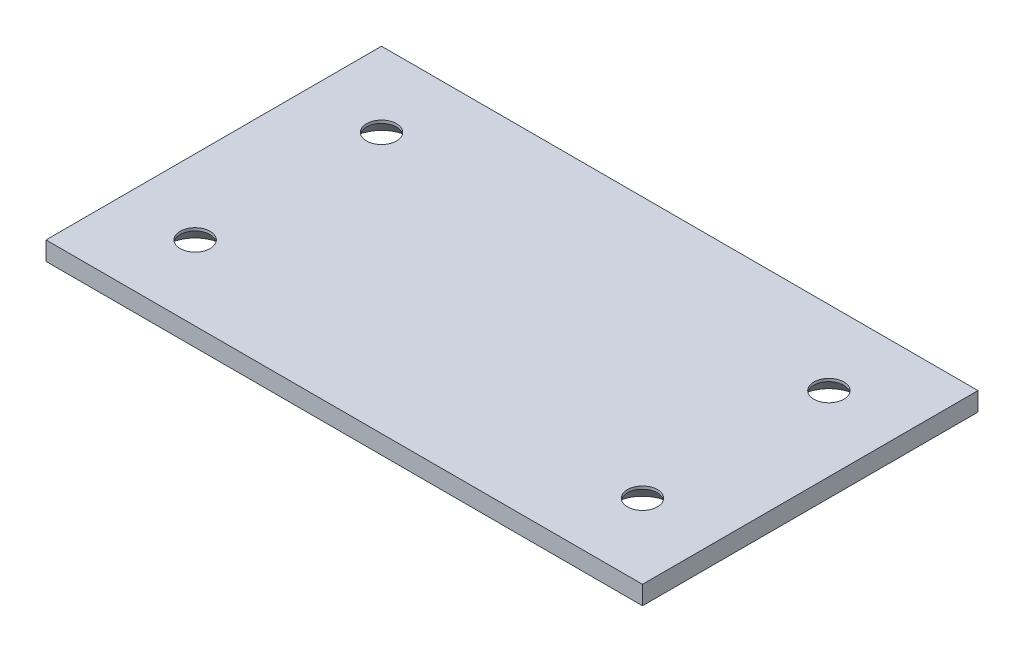
ISO-10303-21;
HEADER;
FILE_DESCRIPTION(('STEP AP214'),'2;1');
FILE_NAME('part.step','',(''),(''),'','','');
FILE_SCHEMA(('AUTOMOTIVE_DESIGN { 1 0 10303 214 1 1 1 1 }'));
ENDSEC;
DATA;
#1=APPLICATION_CONTEXT('core data for automotive mechanical design processes');
#2=APPLICATION_PROTOCOL_DEFINITION('international standard','automotive_design',2000,#1);
#3=PRODUCT_CONTEXT('',#1,'mechanical');
#4=PRODUCT('Part','Part','',(#3));
#5=PRODUCT_RELATED_PRODUCT_CATEGORY('part','',(#4));
#6=PRODUCT_DEFINITION_FORMATION('','',#4);
#7=PRODUCT_DEFINITION_CONTEXT('part definition',#1,'design');
#8=PRODUCT_DEFINITION('design','',#6,#7);
#9=PRODUCT_DEFINITION_SHAPE('','',#8);
#10=(LENGTH_UNIT() NAMED_UNIT(*) SI_UNIT(.MILLI.,.METRE.));
#11=(NAMED_UNIT(*) PLANE_ANGLE_UNIT() SI_UNIT($,.RADIAN.));
#12=(NAMED_UNIT(*) SI_UNIT($,.STERADIAN.) SOLID_ANGLE_UNIT());
#13=UNCERTAINTY_MEASURE_WITH_UNIT(LENGTH_MEASURE(1.E-05),#10,'distance_accuracy_value','');
#14=(GEOMETRIC_REPRESENTATION_CONTEXT(3) GLOBAL_UNCERTAINTY_ASSIGNED_CONTEXT((#13)) GLOBAL_UNIT_ASSIGNED_CONTEXT((#10,
#11,#12)) REPRESENTATION_CONTEXT('',''));
#15=CARTESIAN_POINT('',(0.,0.,0.));
#16=DIRECTION('',(0.,0.,1.));
#17=DIRECTION('',(1.,0.,0.));
#18=AXIS2_PLACEMENT_3D('',#15,#16,#17);
#19=CARTESIAN_POINT('',(50.8,3.175,28.575));
#20=DIRECTION('',(-1.,0.,0.));
#21=DIRECTION('',(0.,0.,1.));
#22=AXIS2_PLACEMENT_3D('',#19,#20,#21);
#23=PLANE('',#22);
#24=DIRECTION('',(0.,0.,-1.));
#25=VECTOR('',#24,1.);
#26=CARTESIAN_POINT('',(50.8,0.,28.575));
#27=LINE('',#26,#25);
#28=CARTESIAN_POINT('',(50.8,0.,28.575));
#29=VERTEX_POINT('',#28);
#30=CARTESIAN_POINT('',(50.8,0.,-28.575));
#31=VERTEX_POINT('',#30);
#32=EDGE_CURVE('E99',#29,#31,#27,.T.);
#33=ORIENTED_EDGE('',*,*,#32,.T.);
#34=DIRECTION('',(0.,-1.,0.));
#35=VECTOR('',#34,1.);
#36=CARTESIAN_POINT('',(50.8,3.175,-28.575));
#37=LINE('',#36,#35);
#38=CARTESIAN_POINT('',(50.8,3.175,-28.575));
#39=VERTEX_POINT('',#38);
#40=EDGE_CURVE('E11',#39,#31,#37,.T.);
#41=ORIENTED_EDGE('',*,*,#40,.F.);
#42=DIRECTION('',(0.,0.,-1.));
#43=VECTOR('',#42,1.);
#44=CARTESIAN_POINT('',(50.8,3.175,28.575));
#45=LINE('',#44,#43);
#46=CARTESIAN_POINT('',(50.8,3.175,28.575));
#47=VERTEX_POINT('',#46);
#48=EDGE_CURVE('E87',#47,#39,#45,.T.);
#49=ORIENTED_EDGE('',*,*,#48,.F.);
#50=DIRECTION('',(0.,-1.,0.));
#51=VECTOR('',#50,1.);
#52=CARTESIAN_POINT('',(50.8,3.175,28.575));
#53=LINE('',#52,#51);
#54=EDGE_CURVE('E95',#47,#29,#53,.T.);
#55=ORIENTED_EDGE('',*,*,#54,.T.);
#56=EDGE_LOOP('',(#33,#41,#49,#55));
#57=FACE_BOUND('',#56,.T.);
#58=ADVANCED_FACE('F36',(#57),#23,.F.);
#59=CARTESIAN_POINT('',(-50.8,3.175,-28.575));
#60=DIRECTION('',(0.,0.,1.));
#61=DIRECTION('',(1.,0.,0.));
#62=AXIS2_PLACEMENT_3D('',#59,#60,#61);
#63=PLANE('',#62);
#64=DIRECTION('',(-1.,0.,0.));
#65=VECTOR('',#64,1.);
#66=CARTESIAN_POINT('',(-50.8,0.,-28.575));
#67=LINE('',#66,#65);
#68=CARTESIAN_POINT('',(-50.8,0.,-28.575));
#69=VERTEX_POINT('',#68);
#70=EDGE_CURVE('E91',#31,#69,#67,.T.);
#71=ORIENTED_EDGE('',*,*,#70,.T.);
#72=DIRECTION('',(0.,-1.,0.));
#73=VECTOR('',#72,1.);
#74=CARTESIAN_POINT('',(-50.8,3.175,-28.575));
#75=LINE('',#74,#73);
#76=CARTESIAN_POINT('',(-50.8,3.175,-28.575));
#77=VERTEX_POINT('',#76);
#78=EDGE_CURVE('E44',#77,#69,#75,.T.);
#79=ORIENTED_EDGE('',*,*,#78,.F.);
#80=DIRECTION('',(-1.,0.,0.));
#81=VECTOR('',#80,1.);
#82=CARTESIAN_POINT('',(-50.8,3.175,-28.575));
#83=LINE('',#82,#81);
#84=EDGE_CURVE('E82',#39,#77,#83,.T.);
#85=ORIENTED_EDGE('',*,*,#84,.F.);
#86=ORIENTED_EDGE('',*,*,#40,.T.);
#87=EDGE_LOOP('',(#71,#79,#85,#86));
#88=FACE_BOUND('',#87,.T.);
#89=ADVANCED_FACE('F90',(#88),#63,.F.);
#90=CARTESIAN_POINT('',(-50.8,3.175,28.575));
#91=DIRECTION('',(1.,0.,0.));
#92=DIRECTION('',(0.,0.,-1.));
#93=AXIS2_PLACEMENT_3D('',#90,#91,#92);
#94=PLANE('',#93);
#95=DIRECTION('',(0.,0.,1.));
#96=VECTOR('',#95,1.);
#97=CARTESIAN_POINT('',(-50.8,0.,28.575));
#98=LINE('',#97,#96);
#99=CARTESIAN_POINT('',(-50.8,0.,28.575));
#100=VERTEX_POINT('',#99);
#101=EDGE_CURVE('E69',#69,#100,#98,.T.);
#102=ORIENTED_EDGE('',*,*,#101,.T.);
#103=DIRECTION('',(0.,-1.,0.));
#104=VECTOR('',#103,1.);
#105=CARTESIAN_POINT('',(-50.8,3.175,28.575));
#106=LINE('',#105,#104);
#107=CARTESIAN_POINT('',(-50.8,3.175,28.575));
#108=VERTEX_POINT('',#107);
#109=EDGE_CURVE('E92',#108,#100,#106,.T.);
#110=ORIENTED_EDGE('',*,*,#109,.F.);
#111=DIRECTION('',(0.,0.,1.));
#112=VECTOR('',#111,1.);
#113=CARTESIAN_POINT('',(-50.8,3.175,28.575));
#114=LINE('',#113,#112);
#115=EDGE_CURVE('E85',#77,#108,#114,.T.);
#116=ORIENTED_EDGE('',*,*,#115,.F.);
#117=ORIENTED_EDGE('',*,*,#78,.T.);
#118=EDGE_LOOP('',(#102,#110,#116,#117));
#119=FACE_BOUND('',#118,.T.);
#120=ADVANCED_FACE('F93',(#119),#94,.F.);
#121=CARTESIAN_POINT('',(-50.8,3.175,28.575));
#122=DIRECTION('',(0.,0.,-1.));
#123=DIRECTION('',(-1.,0.,0.));
#124=AXIS2_PLACEMENT_3D('',#121,#122,#123);
#125=PLANE('',#124);
#126=DIRECTION('',(1.,0.,0.));
#127=VECTOR('',#126,1.);
#128=CARTESIAN_POINT('',(-50.8,0.,28.575));
#129=LINE('',#128,#127);
#130=EDGE_CURVE('E75',#100,#29,#129,.T.);
#131=ORIENTED_EDGE('',*,*,#130,.T.);
#132=ORIENTED_EDGE('',*,*,#54,.F.);
#133=DIRECTION('',(1.,0.,0.));
#134=VECTOR('',#133,1.);
#135=CARTESIAN_POINT('',(-50.8,3.175,28.575));
#136=LINE('',#135,#134);
#137=EDGE_CURVE('E52',#108,#47,#136,.T.);
#138=ORIENTED_EDGE('',*,*,#137,.F.);
#139=ORIENTED_EDGE('',*,*,#109,.T.);
#140=EDGE_LOOP('',(#131,#132,#138,#139));
#141=FACE_BOUND('',#140,.T.);
#142=ADVANCED_FACE('F107',(#141),#125,.F.);
#143=CARTESIAN_POINT('',(0.,3.175,0.));
#144=DIRECTION('',(0.,-1.,0.));
#145=DIRECTION('',(0.,0.,-1.));
#146=AXIS2_PLACEMENT_3D('',#143,#144,#145);
#147=PLANE('',#146);
#148=CARTESIAN_POINT('',(-38.1,3.175,15.875));
#149=DIRECTION('',(0.,-1.,0.));
#150=DIRECTION('',(0.,0.,-1.));
#151=AXIS2_PLACEMENT_3D('',#148,#149,#150);
#152=CIRCLE('',#151,2.5527);
#153=CARTESIAN_POINT('',(-38.1,3.175,13.3223));
#154=VERTEX_POINT('',#153);
#155=EDGE_CURVE('E139',#154,#154,#152,.T.);
#156=ORIENTED_EDGE('',*,*,#155,.T.);
#157=EDGE_LOOP('',(#156));
#158=FACE_BOUND('',#157,.T.);
#159=CARTESIAN_POINT('',(-38.1,3.175,-15.875));
#160=DIRECTION('',(0.,-1.,0.));
#161=DIRECTION('',(0.,0.,-1.));
#162=AXIS2_PLACEMENT_3D('',#159,#160,#161);
#163=CIRCLE('',#162,2.5527);
#164=CARTESIAN_POINT('',(-38.1,3.175,-18.4277));
#165=VERTEX_POINT('',#164);
#166=EDGE_CURVE('E130',#165,#165,#163,.T.);
#167=ORIENTED_EDGE('',*,*,#166,.T.);
#168=EDGE_LOOP('',(#167));
#169=FACE_BOUND('',#168,.T.);
#170=CARTESIAN_POINT('',(38.1,3.175,15.875));
#171=DIRECTION('',(0.,-1.,0.));
#172=DIRECTION('',(0.,0.,-1.));
#173=AXIS2_PLACEMENT_3D('',#170,#171,#172);
#174=CIRCLE('',#173,2.5527);
#175=CARTESIAN_POINT('',(38.1,3.175,13.3223));
#176=VERTEX_POINT('',#175);
#177=EDGE_CURVE('E121',#176,#176,#174,.T.);
#178=ORIENTED_EDGE('',*,*,#177,.T.);
#179=EDGE_LOOP('',(#178));
#180=FACE_BOUND('',#179,.T.);
#181=CARTESIAN_POINT('',(38.1,3.175,-15.875));
#182=DIRECTION('',(0.,-1.,0.));
#183=DIRECTION('',(0.,0.,-1.));
#184=AXIS2_PLACEMENT_3D('',#181,#182,#183);
#185=CIRCLE('',#184,2.5527);
#186=CARTESIAN_POINT('',(38.1,3.175,-18.4277));
#187=VERTEX_POINT('',#186);
#188=EDGE_CURVE('E102',#187,#187,#185,.T.);
#189=ORIENTED_EDGE('',*,*,#188,.T.);
#190=EDGE_LOOP('',(#189));
#191=FACE_BOUND('',#190,.T.);
#192=ORIENTED_EDGE('',*,*,#48,.T.);
#193=ORIENTED_EDGE('',*,*,#84,.T.);
#194=ORIENTED_EDGE('',*,*,#115,.T.);
#195=ORIENTED_EDGE('',*,*,#137,.T.);
#196=EDGE_LOOP('',(#192,#193,#194,#195));
#197=FACE_BOUND('',#196,.T.);
#198=ADVANCED_FACE('F83',(#158,#169,#180,#191,#197),#147,.F.);
#199=CARTESIAN_POINT('',(0.,0.,0.));
#200=DIRECTION('',(0.,-1.,0.));
#201=DIRECTION('',(0.,0.,-1.));
#202=AXIS2_PLACEMENT_3D('',#199,#200,#201);
#203=PLANE('',#202);
#204=CARTESIAN_POINT('',(-38.1,0.,15.875));
#205=DIRECTION('',(0.,-1.,0.));
#206=DIRECTION('',(0.,0.,-1.));
#207=AXIS2_PLACEMENT_3D('',#204,#205,#206);
#208=CIRCLE('',#207,4.8895);
#209=CARTESIAN_POINT('',(-38.1,0.,10.9855));
#210=VERTEX_POINT('',#209);
#211=EDGE_CURVE('E145',#210,#210,#208,.T.);
#212=ORIENTED_EDGE('',*,*,#211,.F.);
#213=EDGE_LOOP('',(#212));
#214=FACE_BOUND('',#213,.T.);
#215=CARTESIAN_POINT('',(-38.1,0.,-15.875));
#216=DIRECTION('',(0.,-1.,0.));
#217=DIRECTION('',(0.,0.,-1.));
#218=AXIS2_PLACEMENT_3D('',#215,#216,#217);
#219=CIRCLE('',#218,4.8895);
#220=CARTESIAN_POINT('',(-38.1,0.,-20.7645));
#221=VERTEX_POINT('',#220);
#222=EDGE_CURVE('E136',#221,#221,#219,.T.);
#223=ORIENTED_EDGE('',*,*,#222,.F.);
#224=EDGE_LOOP('',(#223));
#225=FACE_BOUND('',#224,.T.);
#226=CARTESIAN_POINT('',(38.1,0.,15.875));
#227=DIRECTION('',(0.,-1.,0.));
#228=DIRECTION('',(0.,0.,-1.));
#229=AXIS2_PLACEMENT_3D('',#226,#227,#228);
#230=CIRCLE('',#229,4.8895);
#231=CARTESIAN_POINT('',(38.1,0.,10.9855));
#232=VERTEX_POINT('',#231);
#233=EDGE_CURVE('E127',#232,#232,#230,.T.);
#234=ORIENTED_EDGE('',*,*,#233,.F.);
#235=EDGE_LOOP('',(#234));
#236=FACE_BOUND('',#235,.T.);
#237=CARTESIAN_POINT('',(38.1,0.,-15.875));
#238=DIRECTION('',(0.,-1.,0.));
#239=DIRECTION('',(0.,0.,-1.));
#240=AXIS2_PLACEMENT_3D('',#237,#238,#239);
#241=CIRCLE('',#240,4.8895);
#242=CARTESIAN_POINT('',(38.1,0.,-20.7645));
#243=VERTEX_POINT('',#242);
#244=EDGE_CURVE('E118',#243,#243,#241,.T.);
#245=ORIENTED_EDGE('',*,*,#244,.F.);
#246=EDGE_LOOP('',(#245));
#247=FACE_BOUND('',#246,.T.);
#248=ORIENTED_EDGE('',*,*,#32,.F.);
#249=ORIENTED_EDGE('',*,*,#130,.F.);
#250=ORIENTED_EDGE('',*,*,#101,.F.);
#251=ORIENTED_EDGE('',*,*,#70,.F.);
#252=EDGE_LOOP('',(#248,#249,#250,#251));
#253=FACE_BOUND('',#252,.T.);
#254=ADVANCED_FACE('F110',(#214,#225,#236,#247,#253),#203,.T.);
#255=CARTESIAN_POINT('',(38.1,0.,-15.875));
#256=DIRECTION('',(0.,-1.,0.));
#257=DIRECTION('',(0.,0.,-1.));
#258=AXIS2_PLACEMENT_3D('',#255,#256,#257);
#259=CYLINDRICAL_SURFACE('',#258,2.5527);
#260=ORIENTED_EDGE('',*,*,#188,.F.);
#261=EDGE_LOOP('',(#260));
#262=FACE_BOUND('',#261,.T.);
#263=CARTESIAN_POINT('',(38.1,2.68818089399406,-15.875));
#264=DIRECTION('',(0.,-1.,0.));
#265=DIRECTION('',(0.,0.,-1.));
#266=AXIS2_PLACEMENT_3D('',#263,#264,#265);
#267=CIRCLE('',#266,2.5527);
#268=CARTESIAN_POINT('',(38.1,2.68818089399406,-18.4277));
#269=VERTEX_POINT('',#268);
#270=EDGE_CURVE('E115',#269,#269,#267,.T.);
#271=ORIENTED_EDGE('',*,*,#270,.T.);
#272=EDGE_LOOP('',(#271));
#273=FACE_BOUND('',#272,.T.);
#274=ADVANCED_FACE('F153',(#262,#273),#259,.F.);
#275=CARTESIAN_POINT('',(38.1,0.,-15.875));
#276=DIRECTION('',(0.,-1.,0.));
#277=DIRECTION('',(0.,0.,-1.));
#278=AXIS2_PLACEMENT_3D('',#275,#276,#277);
#279=CONICAL_SURFACE('',#278,4.8895,0.715584993317675);
#280=ORIENTED_EDGE('',*,*,#270,.F.);
#281=EDGE_LOOP('',(#280));
#282=FACE_BOUND('',#281,.T.);
#283=ORIENTED_EDGE('',*,*,#244,.T.);
#284=EDGE_LOOP('',(#283));
#285=FACE_BOUND('',#284,.T.);
#286=ADVANCED_FACE('F161',(#282,#285),#279,.F.);
#287=CARTESIAN_POINT('',(38.1,0.,15.875));
#288=DIRECTION('',(0.,-1.,0.));
#289=DIRECTION('',(0.,0.,-1.));
#290=AXIS2_PLACEMENT_3D('',#287,#288,#289);
#291=CYLINDRICAL_SURFACE('',#290,2.5527);
#292=ORIENTED_EDGE('',*,*,#177,.F.);
#293=EDGE_LOOP('',(#292));
#294=FACE_BOUND('',#293,.T.);
#295=CARTESIAN_POINT('',(38.1,2.68818089399406,15.875));
#296=DIRECTION('',(0.,-1.,0.));
#297=DIRECTION('',(0.,0.,-1.));
#298=AXIS2_PLACEMENT_3D('',#295,#296,#297);
#299=CIRCLE('',#298,2.5527);
#300=CARTESIAN_POINT('',(38.1,2.68818089399406,13.3223));
#301=VERTEX_POINT('',#300);
#302=EDGE_CURVE('E124',#301,#301,#299,.T.);
#303=ORIENTED_EDGE('',*,*,#302,.T.);
#304=EDGE_LOOP('',(#303));
#305=FACE_BOUND('',#304,.T.);
#306=ADVANCED_FACE('F163',(#294,#305),#291,.F.);
#307=CARTESIAN_POINT('',(38.1,0.,15.875));
#308=DIRECTION('',(0.,-1.,0.));
#309=DIRECTION('',(0.,0.,-1.));
#310=AXIS2_PLACEMENT_3D('',#307,#308,#309);
#311=CONICAL_SURFACE('',#310,4.8895,0.715584993317675);
#312=ORIENTED_EDGE('',*,*,#302,.F.);
#313=EDGE_LOOP('',(#312));
#314=FACE_BOUND('',#313,.T.);
#315=ORIENTED_EDGE('',*,*,#233,.T.);
#316=EDGE_LOOP('',(#315));
#317=FACE_BOUND('',#316,.T.);
#318=ADVANCED_FACE('F170',(#314,#317),#311,.F.);
#319=CARTESIAN_POINT('',(-38.1,0.,-15.875));
#320=DIRECTION('',(0.,-1.,0.));
#321=DIRECTION('',(0.,0.,-1.));
#322=AXIS2_PLACEMENT_3D('',#319,#320,#321);
#323=CYLINDRICAL_SURFACE('',#322,2.5527);
#324=ORIENTED_EDGE('',*,*,#166,.F.);
#325=EDGE_LOOP('',(#324));
#326=FACE_BOUND('',#325,.T.);
#327=CARTESIAN_POINT('',(-38.1,2.68818089399406,-15.875));
#328=DIRECTION('',(0.,-1.,0.));
#329=DIRECTION('',(0.,0.,-1.));
#330=AXIS2_PLACEMENT_3D('',#327,#328,#329);
#331=CIRCLE('',#330,2.5527);
#332=CARTESIAN_POINT('',(-38.1,2.68818089399406,-18.4277));
#333=VERTEX_POINT('',#332);
#334=EDGE_CURVE('E133',#333,#333,#331,.T.);
#335=ORIENTED_EDGE('',*,*,#334,.T.);
#336=EDGE_LOOP('',(#335));
#337=FACE_BOUND('',#336,.T.);
#338=ADVANCED_FACE('F204',(#326,#337),#323,.F.);
#339=CARTESIAN_POINT('',(-38.1,0.,-15.875));
#340=DIRECTION('',(0.,-1.,0.));
#341=DIRECTION('',(0.,0.,-1.));
#342=AXIS2_PLACEMENT_3D('',#339,#340,#341);
#343=CONICAL_SURFACE('',#342,4.8895,0.715584993317675);
#344=ORIENTED_EDGE('',*,*,#334,.F.);
#345=EDGE_LOOP('',(#344));
#346=FACE_BOUND('',#345,.T.);
#347=ORIENTED_EDGE('',*,*,#222,.T.);
#348=EDGE_LOOP('',(#347));
#349=FACE_BOUND('',#348,.T.);
#350=ADVANCED_FACE('F209',(#346,#349),#343,.F.);
#351=CARTESIAN_POINT('',(-38.1,0.,15.875));
#352=DIRECTION('',(0.,-1.,0.));
#353=DIRECTION('',(0.,0.,-1.));
#354=AXIS2_PLACEMENT_3D('',#351,#352,#353);
#355=CYLINDRICAL_SURFACE('',#354,2.5527);
#356=ORIENTED_EDGE('',*,*,#155,.F.);
#357=EDGE_LOOP('',(#356));
#358=FACE_BOUND('',#357,.T.);
#359=CARTESIAN_POINT('',(-38.1,2.68818089399406,15.875));
#360=DIRECTION('',(0.,-1.,0.));
#361=DIRECTION('',(0.,0.,-1.));
#362=AXIS2_PLACEMENT_3D('',#359,#360,#361);
#363=CIRCLE('',#362,2.5527);
#364=CARTESIAN_POINT('',(-38.1,2.68818089399406,13.3223));
#365=VERTEX_POINT('',#364);
#366=EDGE_CURVE('E142',#365,#365,#363,.T.);
#367=ORIENTED_EDGE('',*,*,#366,.T.);
#368=EDGE_LOOP('',(#367));
#369=FACE_BOUND('',#368,.T.);
#370=ADVANCED_FACE('F215',(#358,#369),#355,.F.);
#371=CARTESIAN_POINT('',(-38.1,0.,15.875));
#372=DIRECTION('',(0.,-1.,0.));
#373=DIRECTION('',(0.,0.,-1.));
#374=AXIS2_PLACEMENT_3D('',#371,#372,#373);
#375=CONICAL_SURFACE('',#374,4.8895,0.715584993317675);
#376=ORIENTED_EDGE('',*,*,#366,.F.);
#377=EDGE_LOOP('',(#376));
#378=FACE_BOUND('',#377,.T.);
#379=ORIENTED_EDGE('',*,*,#211,.T.);
#380=EDGE_LOOP('',(#379));
#381=FACE_BOUND('',#380,.T.);
#382=ADVANCED_FACE('F149',(#378,#381),#375,.F.);
#383=CLOSED_SHELL('',(#58,#89,#120,#142,#198,#254,#274,#286,#306,#318,#338,#350,#370,#382));
#384=MANIFOLD_SOLID_BREP('B2',#383);
#385=ADVANCED_BREP_SHAPE_REPRESENTATION('',(#18,#384),#14);
#386=SHAPE_DEFINITION_REPRESENTATION(#9,#385);
ENDSEC;
END-ISO-10303-21;
